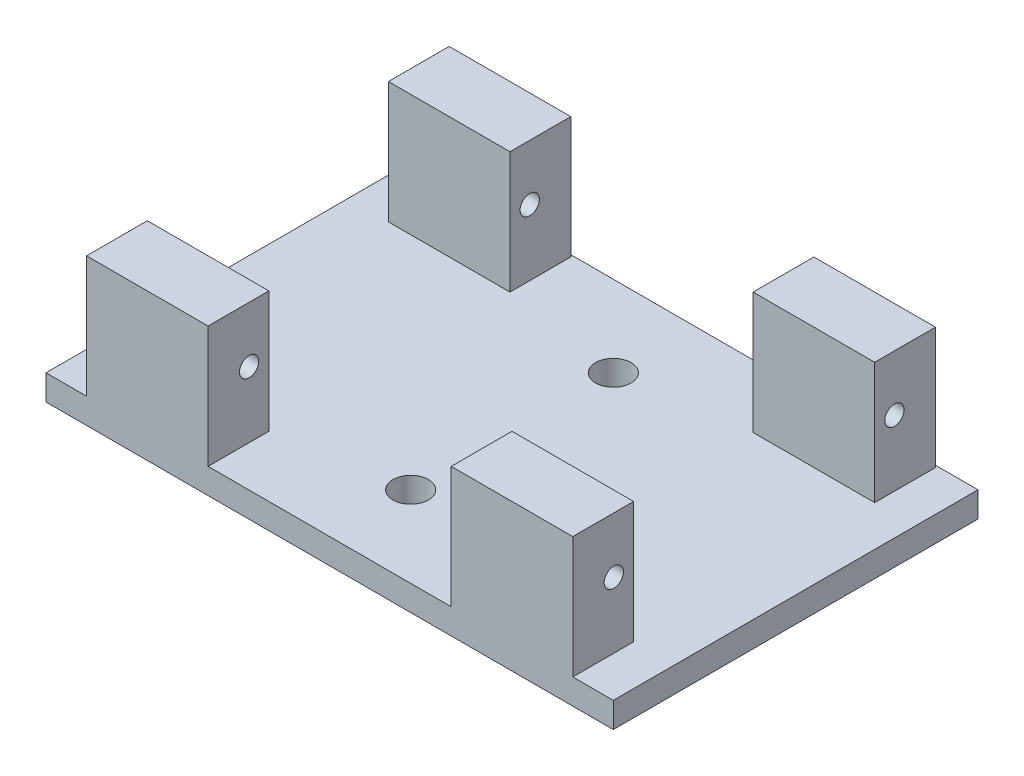
ISO-10303-21;
HEADER;
FILE_DESCRIPTION(('STEP AP214'),'2;1');
FILE_NAME('part.step','',(''),(''),'','','');
FILE_SCHEMA(('AUTOMOTIVE_DESIGN { 1 0 10303 214 1 1 1 1 }'));
ENDSEC;
DATA;
#1=APPLICATION_CONTEXT('core data for automotive mechanical design processes');
#2=APPLICATION_PROTOCOL_DEFINITION('international standard','automotive_design',2000,#1);
#3=PRODUCT_CONTEXT('',#1,'mechanical');
#4=PRODUCT('Part','Part','',(#3));
#5=PRODUCT_RELATED_PRODUCT_CATEGORY('part','',(#4));
#6=PRODUCT_DEFINITION_FORMATION('','',#4);
#7=PRODUCT_DEFINITION_CONTEXT('part definition',#1,'design');
#8=PRODUCT_DEFINITION('design','',#6,#7);
#9=PRODUCT_DEFINITION_SHAPE('','',#8);
#10=(LENGTH_UNIT() NAMED_UNIT(*) SI_UNIT(.MILLI.,.METRE.));
#11=(NAMED_UNIT(*) PLANE_ANGLE_UNIT() SI_UNIT($,.RADIAN.));
#12=(NAMED_UNIT(*) SI_UNIT($,.STERADIAN.) SOLID_ANGLE_UNIT());
#13=UNCERTAINTY_MEASURE_WITH_UNIT(LENGTH_MEASURE(1.E-05),#10,'distance_accuracy_value','');
#14=(GEOMETRIC_REPRESENTATION_CONTEXT(3) GLOBAL_UNCERTAINTY_ASSIGNED_CONTEXT((#13)) GLOBAL_UNIT_ASSIGNED_CONTEXT((#10,
#11,#12)) REPRESENTATION_CONTEXT('',''));
#15=CARTESIAN_POINT('',(0.,0.,0.));
#16=DIRECTION('',(0.,0.,1.));
#17=DIRECTION('',(1.,0.,0.));
#18=AXIS2_PLACEMENT_3D('',#15,#16,#17);
#19=CARTESIAN_POINT('',(0.,2.5,0.));
#20=DIRECTION('',(0.,1.,0.));
#21=DIRECTION('',(0.,0.,1.));
#22=AXIS2_PLACEMENT_3D('',#19,#20,#21);
#23=PLANE('',#22);
#24=CARTESIAN_POINT('',(0.,2.5,10.));
#25=DIRECTION('',(0.,1.,0.));
#26=DIRECTION('',(0.,0.,1.));
#27=AXIS2_PLACEMENT_3D('',#24,#25,#26);
#28=CIRCLE('',#27,1.75);
#29=CARTESIAN_POINT('',(0.,2.5,11.75));
#30=VERTEX_POINT('',#29);
#31=EDGE_CURVE('E691',#30,#30,#28,.T.);
#32=ORIENTED_EDGE('',*,*,#31,.F.);
#33=EDGE_LOOP('',(#32));
#34=FACE_BOUND('',#33,.T.);
#35=CARTESIAN_POINT('',(0.,2.5,-10.));
#36=DIRECTION('',(0.,1.,0.));
#37=DIRECTION('',(0.,0.,1.));
#38=AXIS2_PLACEMENT_3D('',#35,#36,#37);
#39=CIRCLE('',#38,1.75);
#40=CARTESIAN_POINT('',(0.,2.5,-8.25));
#41=VERTEX_POINT('',#40);
#42=EDGE_CURVE('E692',#41,#41,#39,.T.);
#43=ORIENTED_EDGE('',*,*,#42,.F.);
#44=EDGE_LOOP('',(#43));
#45=FACE_BOUND('',#44,.T.);
#46=DIRECTION('',(0.,0.,1.));
#47=VECTOR('',#46,1.);
#48=CARTESIAN_POINT('',(-12.,2.5,-17.8));
#49=LINE('',#48,#47);
#50=CARTESIAN_POINT('',(-12.,2.5,-17.8));
#51=VERTEX_POINT('',#50);
#52=CARTESIAN_POINT('',(-12.,2.5,-11.8));
#53=VERTEX_POINT('',#52);
#54=EDGE_CURVE('E183',#51,#53,#49,.T.);
#55=ORIENTED_EDGE('',*,*,#54,.T.);
#56=DIRECTION('',(-1.,0.,0.));
#57=VECTOR('',#56,1.);
#58=CARTESIAN_POINT('',(-12.,2.5,-11.8));
#59=LINE('',#58,#57);
#60=CARTESIAN_POINT('',(-24.,2.5,-11.8));
#61=VERTEX_POINT('',#60);
#62=EDGE_CURVE('E197',#53,#61,#59,.T.);
#63=ORIENTED_EDGE('',*,*,#62,.T.);
#64=DIRECTION('',(0.,0.,-1.));
#65=VECTOR('',#64,1.);
#66=CARTESIAN_POINT('',(-24.,2.5,-17.8));
#67=LINE('',#66,#65);
#68=CARTESIAN_POINT('',(-24.,2.5,-17.8));
#69=VERTEX_POINT('',#68);
#70=EDGE_CURVE('E61',#61,#69,#67,.T.);
#71=ORIENTED_EDGE('',*,*,#70,.T.);
#72=DIRECTION('',(1.,0.,0.));
#73=VECTOR('',#72,1.);
#74=CARTESIAN_POINT('',(-12.,2.5,-17.8));
#75=LINE('',#74,#73);
#76=EDGE_CURVE('E56',#69,#51,#75,.T.);
#77=ORIENTED_EDGE('',*,*,#76,.T.);
#78=EDGE_LOOP('',(#55,#63,#71,#77));
#79=FACE_BOUND('',#78,.T.);
#80=DIRECTION('',(0.,0.,1.));
#81=VECTOR('',#80,1.);
#82=CARTESIAN_POINT('',(-12.,2.5,12.));
#83=LINE('',#82,#81);
#84=CARTESIAN_POINT('',(-12.,2.5,12.));
#85=VERTEX_POINT('',#84);
#86=CARTESIAN_POINT('',(-12.,2.5,18.));
#87=VERTEX_POINT('',#86);
#88=EDGE_CURVE('E231',#85,#87,#83,.T.);
#89=ORIENTED_EDGE('',*,*,#88,.T.);
#90=DIRECTION('',(1.,0.,0.));
#91=VECTOR('',#90,1.);
#92=CARTESIAN_POINT('',(-28.,2.5,18.));
#93=LINE('',#92,#91);
#94=CARTESIAN_POINT('',(12.,2.5,18.));
#95=VERTEX_POINT('',#94);
#96=EDGE_CURVE('E331',#87,#95,#93,.T.);
#97=ORIENTED_EDGE('',*,*,#96,.T.);
#98=DIRECTION('',(0.,0.,1.));
#99=VECTOR('',#98,1.);
#100=CARTESIAN_POINT('',(12.,2.5,12.));
#101=LINE('',#100,#99);
#102=CARTESIAN_POINT('',(12.,2.5,12.));
#103=VERTEX_POINT('',#102);
#104=EDGE_CURVE('E275',#103,#95,#101,.T.);
#105=ORIENTED_EDGE('',*,*,#104,.F.);
#106=DIRECTION('',(-1.,0.,0.));
#107=VECTOR('',#106,1.);
#108=CARTESIAN_POINT('',(12.,2.5,12.));
#109=LINE('',#108,#107);
#110=CARTESIAN_POINT('',(24.,2.5,12.));
#111=VERTEX_POINT('',#110);
#112=EDGE_CURVE('E303',#111,#103,#109,.T.);
#113=ORIENTED_EDGE('',*,*,#112,.F.);
#114=DIRECTION('',(0.,0.,-1.));
#115=VECTOR('',#114,1.);
#116=CARTESIAN_POINT('',(24.,2.5,12.));
#117=LINE('',#116,#115);
#118=CARTESIAN_POINT('',(24.,2.5,18.));
#119=VERTEX_POINT('',#118);
#120=EDGE_CURVE('E306',#119,#111,#117,.T.);
#121=ORIENTED_EDGE('',*,*,#120,.F.);
#122=CARTESIAN_POINT('',(28.,2.5,18.));
#123=VERTEX_POINT('',#122);
#124=EDGE_CURVE('E327',#119,#123,#93,.T.);
#125=ORIENTED_EDGE('',*,*,#124,.T.);
#126=DIRECTION('',(0.,0.,-1.));
#127=VECTOR('',#126,1.);
#128=CARTESIAN_POINT('',(28.,2.5,-18.));
#129=LINE('',#128,#127);
#130=CARTESIAN_POINT('',(28.,2.5,-18.));
#131=VERTEX_POINT('',#130);
#132=EDGE_CURVE('E319',#123,#131,#129,.T.);
#133=ORIENTED_EDGE('',*,*,#132,.T.);
#134=DIRECTION('',(-1.,0.,0.));
#135=VECTOR('',#134,1.);
#136=CARTESIAN_POINT('',(-28.,2.5,-18.));
#137=LINE('',#136,#135);
#138=CARTESIAN_POINT('',(-28.,2.5,-18.));
#139=VERTEX_POINT('',#138);
#140=EDGE_CURVE('E322',#131,#139,#137,.T.);
#141=ORIENTED_EDGE('',*,*,#140,.T.);
#142=DIRECTION('',(0.,0.,1.));
#143=VECTOR('',#142,1.);
#144=CARTESIAN_POINT('',(-28.,2.5,-18.));
#145=LINE('',#144,#143);
#146=CARTESIAN_POINT('',(-28.,2.5,18.));
#147=VERTEX_POINT('',#146);
#148=EDGE_CURVE('E325',#139,#147,#145,.T.);
#149=ORIENTED_EDGE('',*,*,#148,.T.);
#150=CARTESIAN_POINT('',(-24.,2.5,18.));
#151=VERTEX_POINT('',#150);
#152=EDGE_CURVE('E328',#147,#151,#93,.T.);
#153=ORIENTED_EDGE('',*,*,#152,.T.);
#154=DIRECTION('',(0.,0.,-1.));
#155=VECTOR('',#154,1.);
#156=CARTESIAN_POINT('',(-24.,2.5,12.));
#157=LINE('',#156,#155);
#158=CARTESIAN_POINT('',(-24.,2.5,12.));
#159=VERTEX_POINT('',#158);
#160=EDGE_CURVE('E221',#151,#159,#157,.T.);
#161=ORIENTED_EDGE('',*,*,#160,.T.);
#162=DIRECTION('',(1.,0.,0.));
#163=VECTOR('',#162,1.);
#164=CARTESIAN_POINT('',(-12.,2.5,12.));
#165=LINE('',#164,#163);
#166=EDGE_CURVE('E234',#159,#85,#165,.T.);
#167=ORIENTED_EDGE('',*,*,#166,.T.);
#168=EDGE_LOOP('',(#89,#97,#105,#113,#121,#125,#133,#141,#149,#153,#161,#167));
#169=FACE_BOUND('',#168,.T.);
#170=DIRECTION('',(1.,0.,0.));
#171=VECTOR('',#170,1.);
#172=CARTESIAN_POINT('',(12.,2.5,-11.8));
#173=LINE('',#172,#171);
#174=CARTESIAN_POINT('',(12.,2.5,-11.8));
#175=VERTEX_POINT('',#174);
#176=CARTESIAN_POINT('',(24.,2.5,-11.8));
#177=VERTEX_POINT('',#176);
#178=EDGE_CURVE('E274',#175,#177,#173,.T.);
#179=ORIENTED_EDGE('',*,*,#178,.F.);
#180=DIRECTION('',(0.,0.,1.));
#181=VECTOR('',#180,1.);
#182=CARTESIAN_POINT('',(12.,2.5,-17.8));
#183=LINE('',#182,#181);
#184=CARTESIAN_POINT('',(12.,2.5,-17.8));
#185=VERTEX_POINT('',#184);
#186=EDGE_CURVE('E271',#185,#175,#183,.T.);
#187=ORIENTED_EDGE('',*,*,#186,.F.);
#188=DIRECTION('',(-1.,0.,0.));
#189=VECTOR('',#188,1.);
#190=CARTESIAN_POINT('',(12.,2.5,-17.8));
#191=LINE('',#190,#189);
#192=CARTESIAN_POINT('',(24.,2.5,-17.8));
#193=VERTEX_POINT('',#192);
#194=EDGE_CURVE('E264',#193,#185,#191,.T.);
#195=ORIENTED_EDGE('',*,*,#194,.F.);
#196=DIRECTION('',(0.,0.,-1.));
#197=VECTOR('',#196,1.);
#198=CARTESIAN_POINT('',(24.,2.5,-17.8));
#199=LINE('',#198,#197);
#200=EDGE_CURVE('E277',#177,#193,#199,.T.);
#201=ORIENTED_EDGE('',*,*,#200,.F.);
#202=EDGE_LOOP('',(#179,#187,#195,#201));
#203=FACE_BOUND('',#202,.T.);
#204=ADVANCED_FACE('F41',(#34,#45,#79,#169,#203),#23,.T.);
#205=CARTESIAN_POINT('',(28.,2.5,-18.));
#206=DIRECTION('',(-1.,0.,0.));
#207=DIRECTION('',(0.,0.,1.));
#208=AXIS2_PLACEMENT_3D('',#205,#206,#207);
#209=PLANE('',#208);
#210=DIRECTION('',(0.,0.,-1.));
#211=VECTOR('',#210,1.);
#212=CARTESIAN_POINT('',(28.,0.,-18.));
#213=LINE('',#212,#211);
#214=CARTESIAN_POINT('',(28.,0.,18.));
#215=VERTEX_POINT('',#214);
#216=CARTESIAN_POINT('',(28.,0.,-18.));
#217=VERTEX_POINT('',#216);
#218=EDGE_CURVE('E290',#215,#217,#213,.T.);
#219=ORIENTED_EDGE('',*,*,#218,.T.);
#220=DIRECTION('',(0.,-1.,0.));
#221=VECTOR('',#220,1.);
#222=CARTESIAN_POINT('',(28.,2.5,-18.));
#223=LINE('',#222,#221);
#224=EDGE_CURVE('E11',#131,#217,#223,.T.);
#225=ORIENTED_EDGE('',*,*,#224,.F.);
#226=ORIENTED_EDGE('',*,*,#132,.F.);
#227=DIRECTION('',(0.,-1.,0.));
#228=VECTOR('',#227,1.);
#229=CARTESIAN_POINT('',(28.,2.5,18.));
#230=LINE('',#229,#228);
#231=EDGE_CURVE('E330',#123,#215,#230,.T.);
#232=ORIENTED_EDGE('',*,*,#231,.T.);
#233=EDGE_LOOP('',(#219,#225,#226,#232));
#234=FACE_BOUND('',#233,.T.);
#235=ADVANCED_FACE('F43',(#234),#209,.F.);
#236=CARTESIAN_POINT('',(-28.,2.5,-18.));
#237=DIRECTION('',(0.,0.,1.));
#238=DIRECTION('',(1.,0.,0.));
#239=AXIS2_PLACEMENT_3D('',#236,#237,#238);
#240=PLANE('',#239);
#241=DIRECTION('',(-1.,0.,0.));
#242=VECTOR('',#241,1.);
#243=CARTESIAN_POINT('',(-28.,0.,-18.));
#244=LINE('',#243,#242);
#245=CARTESIAN_POINT('',(-28.,0.,-18.));
#246=VERTEX_POINT('',#245);
#247=EDGE_CURVE('E334',#217,#246,#244,.T.);
#248=ORIENTED_EDGE('',*,*,#247,.T.);
#249=DIRECTION('',(0.,-1.,0.));
#250=VECTOR('',#249,1.);
#251=CARTESIAN_POINT('',(-28.,2.5,-18.));
#252=LINE('',#251,#250);
#253=EDGE_CURVE('E49',#139,#246,#252,.T.);
#254=ORIENTED_EDGE('',*,*,#253,.F.);
#255=ORIENTED_EDGE('',*,*,#140,.F.);
#256=ORIENTED_EDGE('',*,*,#224,.T.);
#257=EDGE_LOOP('',(#248,#254,#255,#256));
#258=FACE_BOUND('',#257,.T.);
#259=ADVANCED_FACE('F401',(#258),#240,.F.);
#260=CARTESIAN_POINT('',(-28.,2.5,-18.));
#261=DIRECTION('',(1.,0.,0.));
#262=DIRECTION('',(0.,0.,-1.));
#263=AXIS2_PLACEMENT_3D('',#260,#261,#262);
#264=PLANE('',#263);
#265=DIRECTION('',(0.,0.,1.));
#266=VECTOR('',#265,1.);
#267=CARTESIAN_POINT('',(-28.,0.,-18.));
#268=LINE('',#267,#266);
#269=CARTESIAN_POINT('',(-28.,0.,18.));
#270=VERTEX_POINT('',#269);
#271=EDGE_CURVE('E336',#246,#270,#268,.T.);
#272=ORIENTED_EDGE('',*,*,#271,.T.);
#273=DIRECTION('',(0.,-1.,0.));
#274=VECTOR('',#273,1.);
#275=CARTESIAN_POINT('',(-28.,2.5,18.));
#276=LINE('',#275,#274);
#277=EDGE_CURVE('E341',#147,#270,#276,.T.);
#278=ORIENTED_EDGE('',*,*,#277,.F.);
#279=ORIENTED_EDGE('',*,*,#148,.F.);
#280=ORIENTED_EDGE('',*,*,#253,.T.);
#281=EDGE_LOOP('',(#272,#278,#279,#280));
#282=FACE_BOUND('',#281,.T.);
#283=ADVANCED_FACE('F348',(#282),#264,.F.);
#284=CARTESIAN_POINT('',(-28.,2.5,18.));
#285=DIRECTION('',(0.,0.,-1.));
#286=DIRECTION('',(-1.,0.,0.));
#287=AXIS2_PLACEMENT_3D('',#284,#285,#286);
#288=PLANE('',#287);
#289=DIRECTION('',(1.,0.,0.));
#290=VECTOR('',#289,1.);
#291=CARTESIAN_POINT('',(-28.,0.,18.));
#292=LINE('',#291,#290);
#293=EDGE_CURVE('E323',#270,#215,#292,.T.);
#294=ORIENTED_EDGE('',*,*,#293,.T.);
#295=ORIENTED_EDGE('',*,*,#231,.F.);
#296=ORIENTED_EDGE('',*,*,#124,.F.);
#297=DIRECTION('',(0.,-1.,0.));
#298=VECTOR('',#297,1.);
#299=CARTESIAN_POINT('',(24.,14.5,18.));
#300=LINE('',#299,#298);
#301=CARTESIAN_POINT('',(24.,14.5,18.));
#302=VERTEX_POINT('',#301);
#303=EDGE_CURVE('E293',#302,#119,#300,.T.);
#304=ORIENTED_EDGE('',*,*,#303,.F.);
#305=DIRECTION('',(1.,0.,0.));
#306=VECTOR('',#305,1.);
#307=CARTESIAN_POINT('',(12.,14.5,18.));
#308=LINE('',#307,#306);
#309=CARTESIAN_POINT('',(12.,14.5,18.));
#310=VERTEX_POINT('',#309);
#311=EDGE_CURVE('E315',#310,#302,#308,.T.);
#312=ORIENTED_EDGE('',*,*,#311,.F.);
#313=DIRECTION('',(0.,-1.,0.));
#314=VECTOR('',#313,1.);
#315=CARTESIAN_POINT('',(12.,14.5,18.));
#316=LINE('',#315,#314);
#317=EDGE_CURVE('E259',#310,#95,#316,.T.);
#318=ORIENTED_EDGE('',*,*,#317,.T.);
#319=ORIENTED_EDGE('',*,*,#96,.F.);
#320=DIRECTION('',(0.,-1.,0.));
#321=VECTOR('',#320,1.);
#322=CARTESIAN_POINT('',(-12.,14.5,18.));
#323=LINE('',#322,#321);
#324=CARTESIAN_POINT('',(-12.,14.5,18.));
#325=VERTEX_POINT('',#324);
#326=EDGE_CURVE('E230',#325,#87,#323,.T.);
#327=ORIENTED_EDGE('',*,*,#326,.F.);
#328=DIRECTION('',(-1.,0.,0.));
#329=VECTOR('',#328,1.);
#330=CARTESIAN_POINT('',(-12.,14.5,18.));
#331=LINE('',#330,#329);
#332=CARTESIAN_POINT('',(-24.,14.5,18.));
#333=VERTEX_POINT('',#332);
#334=EDGE_CURVE('E227',#325,#333,#331,.T.);
#335=ORIENTED_EDGE('',*,*,#334,.T.);
#336=DIRECTION('',(0.,-1.,0.));
#337=VECTOR('',#336,1.);
#338=CARTESIAN_POINT('',(-24.,14.5,18.));
#339=LINE('',#338,#337);
#340=EDGE_CURVE('E240',#333,#151,#339,.T.);
#341=ORIENTED_EDGE('',*,*,#340,.T.);
#342=ORIENTED_EDGE('',*,*,#152,.F.);
#343=ORIENTED_EDGE('',*,*,#277,.T.);
#344=EDGE_LOOP('',(#294,#295,#296,#304,#312,#318,#319,#327,#335,#341,#342,#343));
#345=FACE_BOUND('',#344,.T.);
#346=ADVANCED_FACE('F357',(#345),#288,.F.);
#347=CARTESIAN_POINT('',(0.,0.,0.));
#348=DIRECTION('',(0.,1.,0.));
#349=DIRECTION('',(0.,0.,1.));
#350=AXIS2_PLACEMENT_3D('',#347,#348,#349);
#351=PLANE('',#350);
#352=CARTESIAN_POINT('',(0.,0.,10.));
#353=DIRECTION('',(0.,1.,0.));
#354=DIRECTION('',(0.,0.,1.));
#355=AXIS2_PLACEMENT_3D('',#352,#353,#354);
#356=CIRCLE('',#355,1.75);
#357=CARTESIAN_POINT('',(0.,0.,11.75));
#358=VERTEX_POINT('',#357);
#359=EDGE_CURVE('E689',#358,#358,#356,.T.);
#360=ORIENTED_EDGE('',*,*,#359,.T.);
#361=EDGE_LOOP('',(#360));
#362=FACE_BOUND('',#361,.T.);
#363=CARTESIAN_POINT('',(0.,0.,-10.));
#364=DIRECTION('',(0.,1.,0.));
#365=DIRECTION('',(0.,0.,1.));
#366=AXIS2_PLACEMENT_3D('',#363,#364,#365);
#367=CIRCLE('',#366,1.75);
#368=CARTESIAN_POINT('',(0.,0.,-8.25));
#369=VERTEX_POINT('',#368);
#370=EDGE_CURVE('E697',#369,#369,#367,.T.);
#371=ORIENTED_EDGE('',*,*,#370,.T.);
#372=EDGE_LOOP('',(#371));
#373=FACE_BOUND('',#372,.T.);
#374=ORIENTED_EDGE('',*,*,#218,.F.);
#375=ORIENTED_EDGE('',*,*,#293,.F.);
#376=ORIENTED_EDGE('',*,*,#271,.F.);
#377=ORIENTED_EDGE('',*,*,#247,.F.);
#378=EDGE_LOOP('',(#374,#375,#376,#377));
#379=FACE_BOUND('',#378,.T.);
#380=ADVANCED_FACE('F354',(#362,#373,#379),#351,.F.);
#381=CARTESIAN_POINT('',(12.,14.5,-17.8));
#382=DIRECTION('',(1.,0.,0.));
#383=DIRECTION('',(0.,0.,-1.));
#384=AXIS2_PLACEMENT_3D('',#381,#382,#383);
#385=PLANE('',#384);
#386=CARTESIAN_POINT('',(12.,9.,-13.75));
#387=DIRECTION('',(1.,0.,0.));
#388=DIRECTION('',(0.,0.,-1.));
#389=AXIS2_PLACEMENT_3D('',#386,#387,#388);
#390=CIRCLE('',#389,0.949999999999999);
#391=CARTESIAN_POINT('',(12.,9.,-14.7));
#392=VERTEX_POINT('',#391);
#393=EDGE_CURVE('E256',#392,#392,#390,.T.);
#394=ORIENTED_EDGE('',*,*,#393,.T.);
#395=EDGE_LOOP('',(#394));
#396=FACE_BOUND('',#395,.T.);
#397=ORIENTED_EDGE('',*,*,#186,.T.);
#398=DIRECTION('',(0.,-1.,0.));
#399=VECTOR('',#398,1.);
#400=CARTESIAN_POINT('',(12.,14.5,-11.8));
#401=LINE('',#400,#399);
#402=CARTESIAN_POINT('',(12.,14.5,-11.8));
#403=VERTEX_POINT('',#402);
#404=EDGE_CURVE('E288',#403,#175,#401,.T.);
#405=ORIENTED_EDGE('',*,*,#404,.F.);
#406=DIRECTION('',(0.,0.,1.));
#407=VECTOR('',#406,1.);
#408=CARTESIAN_POINT('',(12.,14.5,-17.8));
#409=LINE('',#408,#407);
#410=CARTESIAN_POINT('',(12.,14.5,-17.8));
#411=VERTEX_POINT('',#410);
#412=EDGE_CURVE('E260',#411,#403,#409,.T.);
#413=ORIENTED_EDGE('',*,*,#412,.F.);
#414=DIRECTION('',(0.,-1.,0.));
#415=VECTOR('',#414,1.);
#416=CARTESIAN_POINT('',(12.,14.5,-17.8));
#417=LINE('',#416,#415);
#418=EDGE_CURVE('E270',#411,#185,#417,.T.);
#419=ORIENTED_EDGE('',*,*,#418,.T.);
#420=EDGE_LOOP('',(#397,#405,#413,#419));
#421=FACE_BOUND('',#420,.T.);
#422=ADVANCED_FACE('F406',(#396,#421),#385,.F.);
#423=CARTESIAN_POINT('',(12.,14.5,-11.8));
#424=DIRECTION('',(0.,0.,-1.));
#425=DIRECTION('',(-1.,0.,0.));
#426=AXIS2_PLACEMENT_3D('',#423,#424,#425);
#427=PLANE('',#426);
#428=ORIENTED_EDGE('',*,*,#178,.T.);
#429=DIRECTION('',(0.,-1.,0.));
#430=VECTOR('',#429,1.);
#431=CARTESIAN_POINT('',(24.,14.5,-11.8));
#432=LINE('',#431,#430);
#433=CARTESIAN_POINT('',(24.,14.5,-11.8));
#434=VERTEX_POINT('',#433);
#435=EDGE_CURVE('E285',#434,#177,#432,.T.);
#436=ORIENTED_EDGE('',*,*,#435,.F.);
#437=DIRECTION('',(1.,0.,0.));
#438=VECTOR('',#437,1.);
#439=CARTESIAN_POINT('',(12.,14.5,-11.8));
#440=LINE('',#439,#438);
#441=EDGE_CURVE('E263',#403,#434,#440,.T.);
#442=ORIENTED_EDGE('',*,*,#441,.F.);
#443=ORIENTED_EDGE('',*,*,#404,.T.);
#444=EDGE_LOOP('',(#428,#436,#442,#443));
#445=FACE_BOUND('',#444,.T.);
#446=ADVANCED_FACE('F426',(#445),#427,.F.);
#447=CARTESIAN_POINT('',(24.,14.5,-17.8));
#448=DIRECTION('',(-1.,0.,0.));
#449=DIRECTION('',(0.,0.,1.));
#450=AXIS2_PLACEMENT_3D('',#447,#448,#449);
#451=PLANE('',#450);
#452=CARTESIAN_POINT('',(24.,9.,-13.75));
#453=DIRECTION('',(1.,0.,0.));
#454=DIRECTION('',(0.,0.,-1.));
#455=AXIS2_PLACEMENT_3D('',#452,#453,#454);
#456=CIRCLE('',#455,0.949999999999999);
#457=CARTESIAN_POINT('',(24.,9.,-14.7));
#458=VERTEX_POINT('',#457);
#459=EDGE_CURVE('E186',#458,#458,#456,.T.);
#460=ORIENTED_EDGE('',*,*,#459,.F.);
#461=EDGE_LOOP('',(#460));
#462=FACE_BOUND('',#461,.T.);
#463=ORIENTED_EDGE('',*,*,#200,.T.);
#464=DIRECTION('',(0.,-1.,0.));
#465=VECTOR('',#464,1.);
#466=CARTESIAN_POINT('',(24.,14.5,-17.8));
#467=LINE('',#466,#465);
#468=CARTESIAN_POINT('',(24.,14.5,-17.8));
#469=VERTEX_POINT('',#468);
#470=EDGE_CURVE('E283',#469,#193,#467,.T.);
#471=ORIENTED_EDGE('',*,*,#470,.F.);
#472=DIRECTION('',(0.,0.,-1.));
#473=VECTOR('',#472,1.);
#474=CARTESIAN_POINT('',(24.,14.5,-17.8));
#475=LINE('',#474,#473);
#476=EDGE_CURVE('E266',#434,#469,#475,.T.);
#477=ORIENTED_EDGE('',*,*,#476,.F.);
#478=ORIENTED_EDGE('',*,*,#435,.T.);
#479=EDGE_LOOP('',(#463,#471,#477,#478));
#480=FACE_BOUND('',#479,.T.);
#481=ADVANCED_FACE('F430',(#462,#480),#451,.F.);
#482=CARTESIAN_POINT('',(12.,14.5,-17.8));
#483=DIRECTION('',(0.,0.,1.));
#484=DIRECTION('',(1.,0.,0.));
#485=AXIS2_PLACEMENT_3D('',#482,#483,#484);
#486=PLANE('',#485);
#487=ORIENTED_EDGE('',*,*,#194,.T.);
#488=ORIENTED_EDGE('',*,*,#418,.F.);
#489=DIRECTION('',(-1.,0.,0.));
#490=VECTOR('',#489,1.);
#491=CARTESIAN_POINT('',(12.,14.5,-17.8));
#492=LINE('',#491,#490);
#493=EDGE_CURVE('E268',#469,#411,#492,.T.);
#494=ORIENTED_EDGE('',*,*,#493,.F.);
#495=ORIENTED_EDGE('',*,*,#470,.T.);
#496=EDGE_LOOP('',(#487,#488,#494,#495));
#497=FACE_BOUND('',#496,.T.);
#498=ADVANCED_FACE('F438',(#497),#486,.F.);
#499=CARTESIAN_POINT('',(0.,14.5,0.));
#500=DIRECTION('',(0.,1.,0.));
#501=DIRECTION('',(0.,0.,1.));
#502=AXIS2_PLACEMENT_3D('',#499,#500,#501);
#503=PLANE('',#502);
#504=ORIENTED_EDGE('',*,*,#412,.T.);
#505=ORIENTED_EDGE('',*,*,#441,.T.);
#506=ORIENTED_EDGE('',*,*,#476,.T.);
#507=ORIENTED_EDGE('',*,*,#493,.T.);
#508=EDGE_LOOP('',(#504,#505,#506,#507));
#509=FACE_BOUND('',#508,.T.);
#510=ADVANCED_FACE('F442',(#509),#503,.T.);
#511=CARTESIAN_POINT('',(12.,14.5,12.));
#512=DIRECTION('',(1.,0.,0.));
#513=DIRECTION('',(0.,0.,-1.));
#514=AXIS2_PLACEMENT_3D('',#511,#512,#513);
#515=PLANE('',#514);
#516=CARTESIAN_POINT('',(12.,9.,13.95));
#517=DIRECTION('',(1.,0.,0.));
#518=DIRECTION('',(0.,0.,-1.));
#519=AXIS2_PLACEMENT_3D('',#516,#517,#518);
#520=CIRCLE('',#519,0.949999999999999);
#521=CARTESIAN_POINT('',(12.,9.,13.));
#522=VERTEX_POINT('',#521);
#523=EDGE_CURVE('E251',#522,#522,#520,.T.);
#524=ORIENTED_EDGE('',*,*,#523,.T.);
#525=EDGE_LOOP('',(#524));
#526=FACE_BOUND('',#525,.T.);
#527=ORIENTED_EDGE('',*,*,#104,.T.);
#528=ORIENTED_EDGE('',*,*,#317,.F.);
#529=DIRECTION('',(0.,0.,1.));
#530=VECTOR('',#529,1.);
#531=CARTESIAN_POINT('',(12.,14.5,12.));
#532=LINE('',#531,#530);
#533=CARTESIAN_POINT('',(12.,14.5,12.));
#534=VERTEX_POINT('',#533);
#535=EDGE_CURVE('E307',#534,#310,#532,.T.);
#536=ORIENTED_EDGE('',*,*,#535,.F.);
#537=DIRECTION('',(0.,-1.,0.));
#538=VECTOR('',#537,1.);
#539=CARTESIAN_POINT('',(12.,14.5,12.));
#540=LINE('',#539,#538);
#541=EDGE_CURVE('E299',#534,#103,#540,.T.);
#542=ORIENTED_EDGE('',*,*,#541,.T.);
#543=EDGE_LOOP('',(#527,#528,#536,#542));
#544=FACE_BOUND('',#543,.T.);
#545=ADVANCED_FACE('F370',(#526,#544),#515,.F.);
#546=CARTESIAN_POINT('',(24.,14.5,12.));
#547=DIRECTION('',(-1.,0.,0.));
#548=DIRECTION('',(0.,0.,1.));
#549=AXIS2_PLACEMENT_3D('',#546,#547,#548);
#550=PLANE('',#549);
#551=CARTESIAN_POINT('',(24.,9.,13.95));
#552=DIRECTION('',(1.,0.,0.));
#553=DIRECTION('',(0.,0.,-1.));
#554=AXIS2_PLACEMENT_3D('',#551,#552,#553);
#555=CIRCLE('',#554,0.949999999999999);
#556=CARTESIAN_POINT('',(24.,9.,13.));
#557=VERTEX_POINT('',#556);
#558=EDGE_CURVE('E248',#557,#557,#555,.T.);
#559=ORIENTED_EDGE('',*,*,#558,.F.);
#560=EDGE_LOOP('',(#559));
#561=FACE_BOUND('',#560,.T.);
#562=ORIENTED_EDGE('',*,*,#120,.T.);
#563=DIRECTION('',(0.,-1.,0.));
#564=VECTOR('',#563,1.);
#565=CARTESIAN_POINT('',(24.,14.5,12.));
#566=LINE('',#565,#564);
#567=CARTESIAN_POINT('',(24.,14.5,12.));
#568=VERTEX_POINT('',#567);
#569=EDGE_CURVE('E296',#568,#111,#566,.T.);
#570=ORIENTED_EDGE('',*,*,#569,.F.);
#571=DIRECTION('',(0.,0.,-1.));
#572=VECTOR('',#571,1.);
#573=CARTESIAN_POINT('',(24.,14.5,12.));
#574=LINE('',#573,#572);
#575=EDGE_CURVE('E313',#302,#568,#574,.T.);
#576=ORIENTED_EDGE('',*,*,#575,.F.);
#577=ORIENTED_EDGE('',*,*,#303,.T.);
#578=EDGE_LOOP('',(#562,#570,#576,#577));
#579=FACE_BOUND('',#578,.T.);
#580=ADVANCED_FACE('F377',(#561,#579),#550,.F.);
#581=CARTESIAN_POINT('',(12.,14.5,12.));
#582=DIRECTION('',(0.,0.,1.));
#583=DIRECTION('',(1.,0.,0.));
#584=AXIS2_PLACEMENT_3D('',#581,#582,#583);
#585=PLANE('',#584);
#586=ORIENTED_EDGE('',*,*,#112,.T.);
#587=ORIENTED_EDGE('',*,*,#541,.F.);
#588=DIRECTION('',(-1.,0.,0.));
#589=VECTOR('',#588,1.);
#590=CARTESIAN_POINT('',(12.,14.5,12.));
#591=LINE('',#590,#589);
#592=EDGE_CURVE('E302',#568,#534,#591,.T.);
#593=ORIENTED_EDGE('',*,*,#592,.F.);
#594=ORIENTED_EDGE('',*,*,#569,.T.);
#595=EDGE_LOOP('',(#586,#587,#593,#594));
#596=FACE_BOUND('',#595,.T.);
#597=ADVANCED_FACE('F374',(#596),#585,.F.);
#598=CARTESIAN_POINT('',(0.,14.5,0.));
#599=DIRECTION('',(0.,1.,0.));
#600=DIRECTION('',(0.,0.,1.));
#601=AXIS2_PLACEMENT_3D('',#598,#599,#600);
#602=PLANE('',#601);
#603=ORIENTED_EDGE('',*,*,#535,.T.);
#604=ORIENTED_EDGE('',*,*,#311,.T.);
#605=ORIENTED_EDGE('',*,*,#575,.T.);
#606=ORIENTED_EDGE('',*,*,#592,.T.);
#607=EDGE_LOOP('',(#603,#604,#605,#606));
#608=FACE_BOUND('',#607,.T.);
#609=ADVANCED_FACE('F380',(#608),#602,.T.);
#610=CARTESIAN_POINT('',(-28.,9.,13.95));
#611=DIRECTION('',(1.,0.,0.));
#612=DIRECTION('',(0.,0.,-1.));
#613=AXIS2_PLACEMENT_3D('',#610,#611,#612);
#614=CYLINDRICAL_SURFACE('',#613,0.949999999999999);
#615=ORIENTED_EDGE('',*,*,#558,.T.);
#616=EDGE_LOOP('',(#615));
#617=FACE_BOUND('',#616,.T.);
#618=ORIENTED_EDGE('',*,*,#523,.F.);
#619=EDGE_LOOP('',(#618));
#620=FACE_BOUND('',#619,.T.);
#621=ADVANCED_FACE('F382',(#617,#620),#614,.F.);
#622=CARTESIAN_POINT('',(-28.,9.,-13.75));
#623=DIRECTION('',(1.,0.,0.));
#624=DIRECTION('',(0.,0.,-1.));
#625=AXIS2_PLACEMENT_3D('',#622,#623,#624);
#626=CYLINDRICAL_SURFACE('',#625,0.949999999999999);
#627=ORIENTED_EDGE('',*,*,#459,.T.);
#628=EDGE_LOOP('',(#627));
#629=FACE_BOUND('',#628,.T.);
#630=ORIENTED_EDGE('',*,*,#393,.F.);
#631=EDGE_LOOP('',(#630));
#632=FACE_BOUND('',#631,.T.);
#633=ADVANCED_FACE('F389',(#629,#632),#626,.F.);
#634=CARTESIAN_POINT('',(-12.,14.5,12.));
#635=DIRECTION('',(1.,0.,0.));
#636=DIRECTION('',(0.,0.,-1.));
#637=AXIS2_PLACEMENT_3D('',#634,#635,#636);
#638=PLANE('',#637);
#639=CARTESIAN_POINT('',(-12.,9.,13.95));
#640=DIRECTION('',(1.,0.,0.));
#641=DIRECTION('',(0.,0.,-1.));
#642=AXIS2_PLACEMENT_3D('',#639,#640,#641);
#643=CIRCLE('',#642,0.949999999999999);
#644=CARTESIAN_POINT('',(-12.,9.,13.));
#645=VERTEX_POINT('',#644);
#646=EDGE_CURVE('E235',#645,#645,#643,.F.);
#647=ORIENTED_EDGE('',*,*,#646,.T.);
#648=EDGE_LOOP('',(#647));
#649=FACE_BOUND('',#648,.T.);
#650=ORIENTED_EDGE('',*,*,#88,.F.);
#651=DIRECTION('',(0.,-1.,0.));
#652=VECTOR('',#651,1.);
#653=CARTESIAN_POINT('',(-12.,14.5,12.));
#654=LINE('',#653,#652);
#655=CARTESIAN_POINT('',(-12.,14.5,12.));
#656=VERTEX_POINT('',#655);
#657=EDGE_CURVE('E208',#656,#85,#654,.T.);
#658=ORIENTED_EDGE('',*,*,#657,.F.);
#659=DIRECTION('',(0.,0.,1.));
#660=VECTOR('',#659,1.);
#661=CARTESIAN_POINT('',(-12.,14.5,12.));
#662=LINE('',#661,#660);
#663=EDGE_CURVE('E217',#656,#325,#662,.T.);
#664=ORIENTED_EDGE('',*,*,#663,.T.);
#665=ORIENTED_EDGE('',*,*,#326,.T.);
#666=EDGE_LOOP('',(#650,#658,#664,#665));
#667=FACE_BOUND('',#666,.T.);
#668=ADVANCED_FACE('F483',(#649,#667),#638,.T.);
#669=CARTESIAN_POINT('',(-12.,14.5,12.));
#670=DIRECTION('',(0.,0.,-1.));
#671=DIRECTION('',(-1.,0.,0.));
#672=AXIS2_PLACEMENT_3D('',#669,#670,#671);
#673=PLANE('',#672);
#674=ORIENTED_EDGE('',*,*,#166,.F.);
#675=DIRECTION('',(0.,-1.,0.));
#676=VECTOR('',#675,1.);
#677=CARTESIAN_POINT('',(-24.,14.5,12.));
#678=LINE('',#677,#676);
#679=CARTESIAN_POINT('',(-24.,14.5,12.));
#680=VERTEX_POINT('',#679);
#681=EDGE_CURVE('E243',#680,#159,#678,.T.);
#682=ORIENTED_EDGE('',*,*,#681,.F.);
#683=DIRECTION('',(1.,0.,0.));
#684=VECTOR('',#683,1.);
#685=CARTESIAN_POINT('',(-12.,14.5,12.));
#686=LINE('',#685,#684);
#687=EDGE_CURVE('E220',#680,#656,#686,.T.);
#688=ORIENTED_EDGE('',*,*,#687,.T.);
#689=ORIENTED_EDGE('',*,*,#657,.T.);
#690=EDGE_LOOP('',(#674,#682,#688,#689));
#691=FACE_BOUND('',#690,.T.);
#692=ADVANCED_FACE('F501',(#691),#673,.T.);
#693=CARTESIAN_POINT('',(-24.,14.5,12.));
#694=DIRECTION('',(-1.,0.,0.));
#695=DIRECTION('',(0.,0.,1.));
#696=AXIS2_PLACEMENT_3D('',#693,#694,#695);
#697=PLANE('',#696);
#698=CARTESIAN_POINT('',(-24.,9.,13.95));
#699=DIRECTION('',(1.,0.,0.));
#700=DIRECTION('',(0.,0.,-1.));
#701=AXIS2_PLACEMENT_3D('',#698,#699,#700);
#702=CIRCLE('',#701,0.949999999999999);
#703=CARTESIAN_POINT('',(-24.,9.,13.));
#704=VERTEX_POINT('',#703);
#705=EDGE_CURVE('E702',#704,#704,#702,.T.);
#706=ORIENTED_EDGE('',*,*,#705,.T.);
#707=EDGE_LOOP('',(#706));
#708=FACE_BOUND('',#707,.T.);
#709=ORIENTED_EDGE('',*,*,#160,.F.);
#710=ORIENTED_EDGE('',*,*,#340,.F.);
#711=DIRECTION('',(0.,0.,-1.));
#712=VECTOR('',#711,1.);
#713=CARTESIAN_POINT('',(-24.,14.5,12.));
#714=LINE('',#713,#712);
#715=EDGE_CURVE('E224',#333,#680,#714,.T.);
#716=ORIENTED_EDGE('',*,*,#715,.T.);
#717=ORIENTED_EDGE('',*,*,#681,.T.);
#718=EDGE_LOOP('',(#709,#710,#716,#717));
#719=FACE_BOUND('',#718,.T.);
#720=ADVANCED_FACE('F511',(#708,#719),#697,.T.);
#721=CARTESIAN_POINT('',(0.,14.5,0.));
#722=DIRECTION('',(0.,1.,0.));
#723=DIRECTION('',(0.,0.,1.));
#724=AXIS2_PLACEMENT_3D('',#721,#722,#723);
#725=PLANE('',#724);
#726=ORIENTED_EDGE('',*,*,#663,.F.);
#727=ORIENTED_EDGE('',*,*,#687,.F.);
#728=ORIENTED_EDGE('',*,*,#715,.F.);
#729=ORIENTED_EDGE('',*,*,#334,.F.);
#730=EDGE_LOOP('',(#726,#727,#728,#729));
#731=FACE_BOUND('',#730,.T.);
#732=ADVANCED_FACE('F521',(#731),#725,.T.);
#733=CARTESIAN_POINT('',(-12.,14.5,-17.8));
#734=DIRECTION('',(1.,0.,0.));
#735=DIRECTION('',(0.,0.,-1.));
#736=AXIS2_PLACEMENT_3D('',#733,#734,#735);
#737=PLANE('',#736);
#738=CARTESIAN_POINT('',(-12.,9.,-13.75));
#739=DIRECTION('',(1.,0.,0.));
#740=DIRECTION('',(0.,0.,-1.));
#741=AXIS2_PLACEMENT_3D('',#738,#739,#740);
#742=CIRCLE('',#741,0.949999999999999);
#743=CARTESIAN_POINT('',(-12.,9.,-14.7));
#744=VERTEX_POINT('',#743);
#745=EDGE_CURVE('E705',#744,#744,#742,.F.);
#746=ORIENTED_EDGE('',*,*,#745,.T.);
#747=EDGE_LOOP('',(#746));
#748=FACE_BOUND('',#747,.T.);
#749=ORIENTED_EDGE('',*,*,#54,.F.);
#750=DIRECTION('',(0.,-1.,0.));
#751=VECTOR('',#750,1.);
#752=CARTESIAN_POINT('',(-12.,14.5,-17.8));
#753=LINE('',#752,#751);
#754=CARTESIAN_POINT('',(-12.,14.5,-17.8));
#755=VERTEX_POINT('',#754);
#756=EDGE_CURVE('E177',#755,#51,#753,.T.);
#757=ORIENTED_EDGE('',*,*,#756,.F.);
#758=DIRECTION('',(0.,0.,1.));
#759=VECTOR('',#758,1.);
#760=CARTESIAN_POINT('',(-12.,14.5,-17.8));
#761=LINE('',#760,#759);
#762=CARTESIAN_POINT('',(-12.,14.5,-11.8));
#763=VERTEX_POINT('',#762);
#764=EDGE_CURVE('E181',#755,#763,#761,.T.);
#765=ORIENTED_EDGE('',*,*,#764,.T.);
#766=DIRECTION('',(0.,-1.,0.));
#767=VECTOR('',#766,1.);
#768=CARTESIAN_POINT('',(-12.,14.5,-11.8));
#769=LINE('',#768,#767);
#770=EDGE_CURVE('E206',#763,#53,#769,.T.);
#771=ORIENTED_EDGE('',*,*,#770,.T.);
#772=EDGE_LOOP('',(#749,#757,#765,#771));
#773=FACE_BOUND('',#772,.T.);
#774=ADVANCED_FACE('F179',(#748,#773),#737,.T.);
#775=CARTESIAN_POINT('',(-12.,14.5,-17.8));
#776=DIRECTION('',(0.,0.,-1.));
#777=DIRECTION('',(-1.,0.,0.));
#778=AXIS2_PLACEMENT_3D('',#775,#776,#777);
#779=PLANE('',#778);
#780=ORIENTED_EDGE('',*,*,#76,.F.);
#781=DIRECTION('',(0.,-1.,0.));
#782=VECTOR('',#781,1.);
#783=CARTESIAN_POINT('',(-24.,14.5,-17.8));
#784=LINE('',#783,#782);
#785=CARTESIAN_POINT('',(-24.,14.5,-17.8));
#786=VERTEX_POINT('',#785);
#787=EDGE_CURVE('E187',#786,#69,#784,.T.);
#788=ORIENTED_EDGE('',*,*,#787,.F.);
#789=DIRECTION('',(1.,0.,0.));
#790=VECTOR('',#789,1.);
#791=CARTESIAN_POINT('',(-12.,14.5,-17.8));
#792=LINE('',#791,#790);
#793=EDGE_CURVE('E193',#786,#755,#792,.T.);
#794=ORIENTED_EDGE('',*,*,#793,.T.);
#795=ORIENTED_EDGE('',*,*,#756,.T.);
#796=EDGE_LOOP('',(#780,#788,#794,#795));
#797=FACE_BOUND('',#796,.T.);
#798=ADVANCED_FACE('F199',(#797),#779,.T.);
#799=CARTESIAN_POINT('',(-24.,14.5,-17.8));
#800=DIRECTION('',(-1.,0.,0.));
#801=DIRECTION('',(0.,0.,1.));
#802=AXIS2_PLACEMENT_3D('',#799,#800,#801);
#803=PLANE('',#802);
#804=CARTESIAN_POINT('',(-24.,9.,-13.75));
#805=DIRECTION('',(1.,0.,0.));
#806=DIRECTION('',(0.,0.,-1.));
#807=AXIS2_PLACEMENT_3D('',#804,#805,#806);
#808=CIRCLE('',#807,0.949999999999999);
#809=CARTESIAN_POINT('',(-24.,9.,-14.7));
#810=VERTEX_POINT('',#809);
#811=EDGE_CURVE('E694',#810,#810,#808,.T.);
#812=ORIENTED_EDGE('',*,*,#811,.T.);
#813=EDGE_LOOP('',(#812));
#814=FACE_BOUND('',#813,.T.);
#815=ORIENTED_EDGE('',*,*,#70,.F.);
#816=DIRECTION('',(0.,-1.,0.));
#817=VECTOR('',#816,1.);
#818=CARTESIAN_POINT('',(-24.,14.5,-11.8));
#819=LINE('',#818,#817);
#820=CARTESIAN_POINT('',(-24.,14.5,-11.8));
#821=VERTEX_POINT('',#820);
#822=EDGE_CURVE('E213',#821,#61,#819,.T.);
#823=ORIENTED_EDGE('',*,*,#822,.F.);
#824=DIRECTION('',(0.,0.,-1.));
#825=VECTOR('',#824,1.);
#826=CARTESIAN_POINT('',(-24.,14.5,-17.8));
#827=LINE('',#826,#825);
#828=EDGE_CURVE('E200',#821,#786,#827,.T.);
#829=ORIENTED_EDGE('',*,*,#828,.T.);
#830=ORIENTED_EDGE('',*,*,#787,.T.);
#831=EDGE_LOOP('',(#815,#823,#829,#830));
#832=FACE_BOUND('',#831,.T.);
#833=ADVANCED_FACE('F549',(#814,#832),#803,.T.);
#834=CARTESIAN_POINT('',(-12.,14.5,-11.8));
#835=DIRECTION('',(0.,0.,1.));
#836=DIRECTION('',(1.,0.,0.));
#837=AXIS2_PLACEMENT_3D('',#834,#835,#836);
#838=PLANE('',#837);
#839=ORIENTED_EDGE('',*,*,#62,.F.);
#840=ORIENTED_EDGE('',*,*,#770,.F.);
#841=DIRECTION('',(-1.,0.,0.));
#842=VECTOR('',#841,1.);
#843=CARTESIAN_POINT('',(-12.,14.5,-11.8));
#844=LINE('',#843,#842);
#845=EDGE_CURVE('E196',#763,#821,#844,.T.);
#846=ORIENTED_EDGE('',*,*,#845,.T.);
#847=ORIENTED_EDGE('',*,*,#822,.T.);
#848=EDGE_LOOP('',(#839,#840,#846,#847));
#849=FACE_BOUND('',#848,.T.);
#850=ADVANCED_FACE('F558',(#849),#838,.T.);
#851=CARTESIAN_POINT('',(0.,14.5,0.));
#852=DIRECTION('',(0.,1.,0.));
#853=DIRECTION('',(0.,0.,1.));
#854=AXIS2_PLACEMENT_3D('',#851,#852,#853);
#855=PLANE('',#854);
#856=ORIENTED_EDGE('',*,*,#764,.F.);
#857=ORIENTED_EDGE('',*,*,#793,.F.);
#858=ORIENTED_EDGE('',*,*,#828,.F.);
#859=ORIENTED_EDGE('',*,*,#845,.F.);
#860=EDGE_LOOP('',(#856,#857,#858,#859));
#861=FACE_BOUND('',#860,.T.);
#862=ADVANCED_FACE('F191',(#861),#855,.T.);
#863=CARTESIAN_POINT('',(28.,9.,-13.75));
#864=DIRECTION('',(-1.,0.,0.));
#865=DIRECTION('',(0.,0.,1.));
#866=AXIS2_PLACEMENT_3D('',#863,#864,#865);
#867=CYLINDRICAL_SURFACE('',#866,0.949999999999999);
#868=ORIENTED_EDGE('',*,*,#745,.F.);
#869=EDGE_LOOP('',(#868));
#870=FACE_BOUND('',#869,.T.);
#871=ORIENTED_EDGE('',*,*,#811,.F.);
#872=EDGE_LOOP('',(#871));
#873=FACE_BOUND('',#872,.T.);
#874=ADVANCED_FACE('F577',(#870,#873),#867,.F.);
#875=CARTESIAN_POINT('',(28.,9.,13.95));
#876=DIRECTION('',(-1.,0.,0.));
#877=DIRECTION('',(0.,0.,1.));
#878=AXIS2_PLACEMENT_3D('',#875,#876,#877);
#879=CYLINDRICAL_SURFACE('',#878,0.949999999999999);
#880=ORIENTED_EDGE('',*,*,#646,.F.);
#881=EDGE_LOOP('',(#880));
#882=FACE_BOUND('',#881,.T.);
#883=ORIENTED_EDGE('',*,*,#705,.F.);
#884=EDGE_LOOP('',(#883));
#885=FACE_BOUND('',#884,.T.);
#886=ADVANCED_FACE('F586',(#882,#885),#879,.F.);
#887=CARTESIAN_POINT('',(0.,0.,-10.));
#888=DIRECTION('',(0.,1.,0.));
#889=DIRECTION('',(0.,0.,1.));
#890=AXIS2_PLACEMENT_3D('',#887,#888,#889);
#891=CYLINDRICAL_SURFACE('',#890,1.75);
#892=ORIENTED_EDGE('',*,*,#370,.F.);
#893=EDGE_LOOP('',(#892));
#894=FACE_BOUND('',#893,.T.);
#895=ORIENTED_EDGE('',*,*,#42,.T.);
#896=EDGE_LOOP('',(#895));
#897=FACE_BOUND('',#896,.T.);
#898=ADVANCED_FACE('F595',(#894,#897),#891,.F.);
#899=CARTESIAN_POINT('',(0.,0.,10.));
#900=DIRECTION('',(0.,1.,0.));
#901=DIRECTION('',(0.,0.,1.));
#902=AXIS2_PLACEMENT_3D('',#899,#900,#901);
#903=CYLINDRICAL_SURFACE('',#902,1.75);
#904=ORIENTED_EDGE('',*,*,#359,.F.);
#905=EDGE_LOOP('',(#904));
#906=FACE_BOUND('',#905,.T.);
#907=ORIENTED_EDGE('',*,*,#31,.T.);
#908=EDGE_LOOP('',(#907));
#909=FACE_BOUND('',#908,.T.);
#910=ADVANCED_FACE('F605',(#906,#909),#903,.F.);
#911=CLOSED_SHELL('',(#204,#235,#259,#283,#346,#380,#422,#446,#481,#498,#510,#545,#580,#597,
#609,#621,#633,#668,#692,#720,#732,#774,#798,#833,#850,#862,#874,#886,#898,#910));
#912=MANIFOLD_SOLID_BREP('B2',#911);
#913=ADVANCED_BREP_SHAPE_REPRESENTATION('',(#18,#912),#14);
#914=SHAPE_DEFINITION_REPRESENTATION(#9,#913);
ENDSEC;
END-ISO-10303-21;
